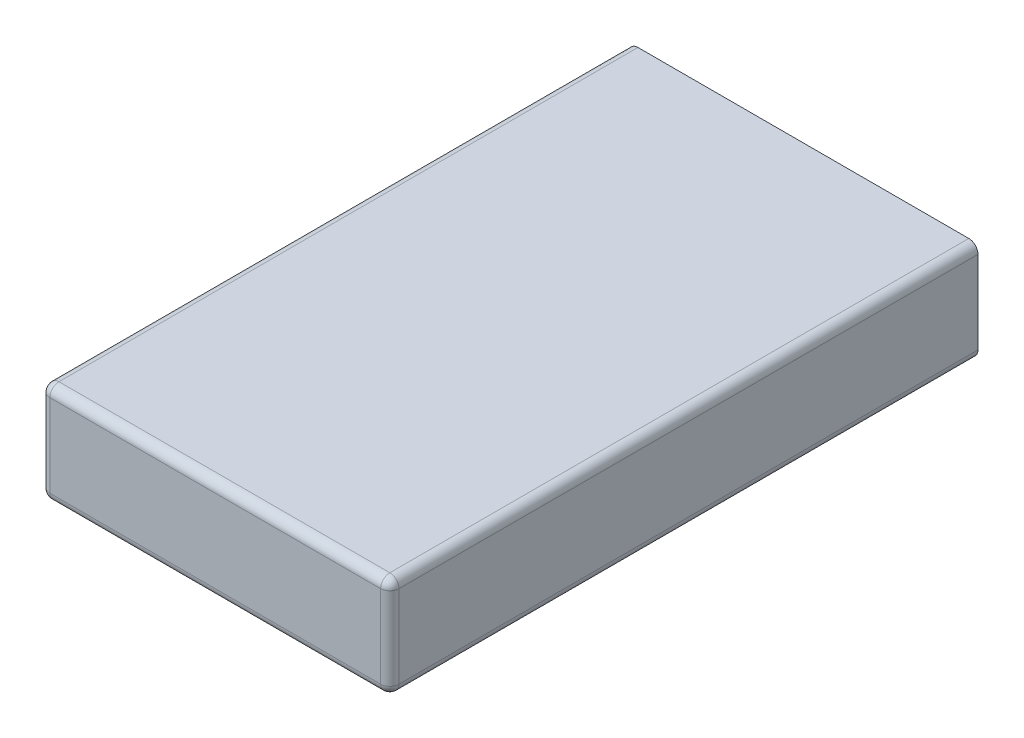
ISO-10303-21;
HEADER;
FILE_DESCRIPTION(('STEP AP214'),'2;1');
FILE_NAME('part.step','',(''),(''),'','','');
FILE_SCHEMA(('AUTOMOTIVE_DESIGN { 1 0 10303 214 1 1 1 1 }'));
ENDSEC;
DATA;
#1=APPLICATION_CONTEXT('core data for automotive mechanical design processes');
#2=APPLICATION_PROTOCOL_DEFINITION('international standard','automotive_design',2000,#1);
#3=PRODUCT_CONTEXT('',#1,'mechanical');
#4=PRODUCT('Part','Part','',(#3));
#5=PRODUCT_RELATED_PRODUCT_CATEGORY('part','',(#4));
#6=PRODUCT_DEFINITION_FORMATION('','',#4);
#7=PRODUCT_DEFINITION_CONTEXT('part definition',#1,'design');
#8=PRODUCT_DEFINITION('design','',#6,#7);
#9=PRODUCT_DEFINITION_SHAPE('','',#8);
#10=(LENGTH_UNIT() NAMED_UNIT(*) SI_UNIT(.MILLI.,.METRE.));
#11=(NAMED_UNIT(*) PLANE_ANGLE_UNIT() SI_UNIT($,.RADIAN.));
#12=(NAMED_UNIT(*) SI_UNIT($,.STERADIAN.) SOLID_ANGLE_UNIT());
#13=UNCERTAINTY_MEASURE_WITH_UNIT(LENGTH_MEASURE(1.E-05),#10,'distance_accuracy_value','');
#14=(GEOMETRIC_REPRESENTATION_CONTEXT(3) GLOBAL_UNCERTAINTY_ASSIGNED_CONTEXT((#13)) GLOBAL_UNIT_ASSIGNED_CONTEXT((#10,
#11,#12)) REPRESENTATION_CONTEXT('',''));
#15=CARTESIAN_POINT('',(0.,0.,0.));
#16=DIRECTION('',(0.,0.,1.));
#17=DIRECTION('',(1.,0.,0.));
#18=AXIS2_PLACEMENT_3D('',#15,#16,#17);
#19=CARTESIAN_POINT('',(0.,0.,0.));
#20=DIRECTION('',(0.,0.,-1.));
#21=DIRECTION('',(-1.,0.,0.));
#22=AXIS2_PLACEMENT_3D('',#19,#20,#21);
#23=PLANE('',#22);
#24=DIRECTION('',(1.,0.,0.));
#25=VECTOR('',#24,1.);
#26=CARTESIAN_POINT('',(-19.,-5.5,0.));
#27=LINE('',#26,#25);
#28=CARTESIAN_POINT('',(-18.,-5.5,0.));
#29=VERTEX_POINT('',#28);
#30=CARTESIAN_POINT('',(18.,-5.5,0.));
#31=VERTEX_POINT('',#30);
#32=EDGE_CURVE('E188',#29,#31,#27,.T.);
#33=ORIENTED_EDGE('',*,*,#32,.F.);
#34=CARTESIAN_POINT('',(-18.,-4.5,0.));
#35=DIRECTION('',(0.,0.,-1.));
#36=DIRECTION('',(-1.,0.,0.));
#37=AXIS2_PLACEMENT_3D('',#34,#35,#36);
#38=CIRCLE('',#37,1.);
#39=CARTESIAN_POINT('',(-19.,-4.5,0.));
#40=VERTEX_POINT('',#39);
#41=EDGE_CURVE('E215',#29,#40,#38,.T.);
#42=ORIENTED_EDGE('',*,*,#41,.T.);
#43=DIRECTION('',(0.,-1.,0.));
#44=VECTOR('',#43,1.);
#45=CARTESIAN_POINT('',(-19.,-5.5,0.));
#46=LINE('',#45,#44);
#47=CARTESIAN_POINT('',(-19.,4.5,0.));
#48=VERTEX_POINT('',#47);
#49=EDGE_CURVE('E185',#48,#40,#46,.T.);
#50=ORIENTED_EDGE('',*,*,#49,.F.);
#51=CARTESIAN_POINT('',(-18.,4.5,0.));
#52=DIRECTION('',(0.,0.,-1.));
#53=DIRECTION('',(-1.,0.,0.));
#54=AXIS2_PLACEMENT_3D('',#51,#52,#53);
#55=CIRCLE('',#54,1.);
#56=CARTESIAN_POINT('',(-18.,5.5,0.));
#57=VERTEX_POINT('',#56);
#58=EDGE_CURVE('E192',#48,#57,#55,.T.);
#59=ORIENTED_EDGE('',*,*,#58,.T.);
#60=DIRECTION('',(-1.,0.,0.));
#61=VECTOR('',#60,1.);
#62=CARTESIAN_POINT('',(-19.,5.5,0.));
#63=LINE('',#62,#61);
#64=CARTESIAN_POINT('',(18.,5.5,0.));
#65=VERTEX_POINT('',#64);
#66=EDGE_CURVE('E183',#65,#57,#63,.T.);
#67=ORIENTED_EDGE('',*,*,#66,.F.);
#68=CARTESIAN_POINT('',(18.,4.5,0.));
#69=DIRECTION('',(0.,0.,-1.));
#70=DIRECTION('',(-1.,0.,0.));
#71=AXIS2_PLACEMENT_3D('',#68,#69,#70);
#72=CIRCLE('',#71,1.);
#73=CARTESIAN_POINT('',(19.,4.5,0.));
#74=VERTEX_POINT('',#73);
#75=EDGE_CURVE('E200',#65,#74,#72,.T.);
#76=ORIENTED_EDGE('',*,*,#75,.T.);
#77=DIRECTION('',(0.,1.,0.));
#78=VECTOR('',#77,1.);
#79=CARTESIAN_POINT('',(19.,-5.5,0.));
#80=LINE('',#79,#78);
#81=CARTESIAN_POINT('',(19.,-4.5,0.));
#82=VERTEX_POINT('',#81);
#83=EDGE_CURVE('E181',#82,#74,#80,.T.);
#84=ORIENTED_EDGE('',*,*,#83,.F.);
#85=CARTESIAN_POINT('',(18.,-4.5,0.));
#86=DIRECTION('',(0.,0.,-1.));
#87=DIRECTION('',(-1.,0.,0.));
#88=AXIS2_PLACEMENT_3D('',#85,#86,#87);
#89=CIRCLE('',#88,1.);
#90=EDGE_CURVE('E208',#82,#31,#89,.T.);
#91=ORIENTED_EDGE('',*,*,#90,.T.);
#92=EDGE_LOOP('',(#33,#42,#50,#59,#67,#76,#84,#91));
#93=FACE_BOUND('',#92,.T.);
#94=DIRECTION('',(1.,0.,0.));
#95=VECTOR('',#94,1.);
#96=CARTESIAN_POINT('',(-18.25,-4.75,0.));
#97=LINE('',#96,#95);
#98=CARTESIAN_POINT('',(-18.25,-4.75,0.));
#99=VERTEX_POINT('',#98);
#100=CARTESIAN_POINT('',(18.25,-4.75,0.));
#101=VERTEX_POINT('',#100);
#102=EDGE_CURVE('E154',#99,#101,#97,.T.);
#103=ORIENTED_EDGE('',*,*,#102,.T.);
#104=DIRECTION('',(0.,1.,0.));
#105=VECTOR('',#104,1.);
#106=CARTESIAN_POINT('',(18.25,-4.75,0.));
#107=LINE('',#106,#105);
#108=CARTESIAN_POINT('',(18.25,4.75,0.));
#109=VERTEX_POINT('',#108);
#110=EDGE_CURVE('E167',#101,#109,#107,.T.);
#111=ORIENTED_EDGE('',*,*,#110,.T.);
#112=DIRECTION('',(-1.,0.,0.));
#113=VECTOR('',#112,1.);
#114=CARTESIAN_POINT('',(-18.25,4.75,0.));
#115=LINE('',#114,#113);
#116=CARTESIAN_POINT('',(-18.25,4.75,0.));
#117=VERTEX_POINT('',#116);
#118=EDGE_CURVE('E170',#109,#117,#115,.T.);
#119=ORIENTED_EDGE('',*,*,#118,.T.);
#120=DIRECTION('',(0.,-1.,0.));
#121=VECTOR('',#120,1.);
#122=CARTESIAN_POINT('',(-18.25,-4.75,0.));
#123=LINE('',#122,#121);
#124=EDGE_CURVE('E173',#117,#99,#123,.T.);
#125=ORIENTED_EDGE('',*,*,#124,.T.);
#126=EDGE_LOOP('',(#103,#111,#119,#125));
#127=FACE_BOUND('',#126,.T.);
#128=ADVANCED_FACE('F35',(#93,#127),#23,.T.);
#129=CARTESIAN_POINT('',(19.,-5.5,63.));
#130=DIRECTION('',(-1.,0.,0.));
#131=DIRECTION('',(0.,0.,1.));
#132=AXIS2_PLACEMENT_3D('',#129,#130,#131);
#133=PLANE('',#132);
#134=DIRECTION('',(0.,0.,-1.));
#135=VECTOR('',#134,1.);
#136=CARTESIAN_POINT('',(19.,4.5,63.));
#137=LINE('',#136,#135);
#138=CARTESIAN_POINT('',(19.,4.5,63.));
#139=VERTEX_POINT('',#138);
#140=EDGE_CURVE('E203',#74,#139,#137,.F.);
#141=ORIENTED_EDGE('',*,*,#140,.T.);
#142=DIRECTION('',(0.,1.,0.));
#143=VECTOR('',#142,1.);
#144=CARTESIAN_POINT('',(19.,-5.5,63.));
#145=LINE('',#144,#143);
#146=CARTESIAN_POINT('',(19.,-4.5,63.));
#147=VERTEX_POINT('',#146);
#148=EDGE_CURVE('E235',#139,#147,#145,.F.);
#149=ORIENTED_EDGE('',*,*,#148,.T.);
#150=DIRECTION('',(0.,0.,-1.));
#151=VECTOR('',#150,1.);
#152=CARTESIAN_POINT('',(19.,-4.5,63.));
#153=LINE('',#152,#151);
#154=EDGE_CURVE('E206',#147,#82,#153,.T.);
#155=ORIENTED_EDGE('',*,*,#154,.T.);
#156=ORIENTED_EDGE('',*,*,#83,.T.);
#157=EDGE_LOOP('',(#141,#149,#155,#156));
#158=FACE_BOUND('',#157,.T.);
#159=ADVANCED_FACE('F285',(#158),#133,.F.);
#160=CARTESIAN_POINT('',(-19.,5.5,63.));
#161=DIRECTION('',(0.,-1.,0.));
#162=DIRECTION('',(0.,0.,-1.));
#163=AXIS2_PLACEMENT_3D('',#160,#161,#162);
#164=PLANE('',#163);
#165=DIRECTION('',(0.,0.,-1.));
#166=VECTOR('',#165,1.);
#167=CARTESIAN_POINT('',(-18.,5.5,63.));
#168=LINE('',#167,#166);
#169=CARTESIAN_POINT('',(-18.,5.5,63.));
#170=VERTEX_POINT('',#169);
#171=EDGE_CURVE('E195',#57,#170,#168,.F.);
#172=ORIENTED_EDGE('',*,*,#171,.T.);
#173=DIRECTION('',(-1.,0.,0.));
#174=VECTOR('',#173,1.);
#175=CARTESIAN_POINT('',(-19.,5.5,63.));
#176=LINE('',#175,#174);
#177=CARTESIAN_POINT('',(18.,5.5,63.));
#178=VERTEX_POINT('',#177);
#179=EDGE_CURVE('E231',#170,#178,#176,.F.);
#180=ORIENTED_EDGE('',*,*,#179,.T.);
#181=DIRECTION('',(0.,0.,-1.));
#182=VECTOR('',#181,1.);
#183=CARTESIAN_POINT('',(18.,5.5,63.));
#184=LINE('',#183,#182);
#185=EDGE_CURVE('E198',#178,#65,#184,.T.);
#186=ORIENTED_EDGE('',*,*,#185,.T.);
#187=ORIENTED_EDGE('',*,*,#66,.T.);
#188=EDGE_LOOP('',(#172,#180,#186,#187));
#189=FACE_BOUND('',#188,.T.);
#190=ADVANCED_FACE('F333',(#189),#164,.F.);
#191=CARTESIAN_POINT('',(-19.,-5.5,63.));
#192=DIRECTION('',(1.,0.,0.));
#193=DIRECTION('',(0.,0.,-1.));
#194=AXIS2_PLACEMENT_3D('',#191,#192,#193);
#195=PLANE('',#194);
#196=DIRECTION('',(0.,0.,-1.));
#197=VECTOR('',#196,1.);
#198=CARTESIAN_POINT('',(-19.,-4.5,63.));
#199=LINE('',#198,#197);
#200=CARTESIAN_POINT('',(-19.,-4.5,63.));
#201=VERTEX_POINT('',#200);
#202=EDGE_CURVE('E217',#40,#201,#199,.F.);
#203=ORIENTED_EDGE('',*,*,#202,.T.);
#204=DIRECTION('',(0.,-1.,0.));
#205=VECTOR('',#204,1.);
#206=CARTESIAN_POINT('',(-19.,-5.5,63.));
#207=LINE('',#206,#205);
#208=CARTESIAN_POINT('',(-19.,4.5,63.));
#209=VERTEX_POINT('',#208);
#210=EDGE_CURVE('E11',#201,#209,#207,.F.);
#211=ORIENTED_EDGE('',*,*,#210,.T.);
#212=DIRECTION('',(0.,0.,-1.));
#213=VECTOR('',#212,1.);
#214=CARTESIAN_POINT('',(-19.,4.5,63.));
#215=LINE('',#214,#213);
#216=EDGE_CURVE('E190',#209,#48,#215,.T.);
#217=ORIENTED_EDGE('',*,*,#216,.T.);
#218=ORIENTED_EDGE('',*,*,#49,.T.);
#219=EDGE_LOOP('',(#203,#211,#217,#218));
#220=FACE_BOUND('',#219,.T.);
#221=ADVANCED_FACE('F312',(#220),#195,.F.);
#222=CARTESIAN_POINT('',(-19.,-5.5,63.));
#223=DIRECTION('',(0.,1.,0.));
#224=DIRECTION('',(0.,0.,1.));
#225=AXIS2_PLACEMENT_3D('',#222,#223,#224);
#226=PLANE('',#225);
#227=DIRECTION('',(0.,0.,-1.));
#228=VECTOR('',#227,1.);
#229=CARTESIAN_POINT('',(18.,-5.5,63.));
#230=LINE('',#229,#228);
#231=CARTESIAN_POINT('',(18.,-5.5,63.));
#232=VERTEX_POINT('',#231);
#233=EDGE_CURVE('E211',#31,#232,#230,.F.);
#234=ORIENTED_EDGE('',*,*,#233,.T.);
#235=DIRECTION('',(1.,0.,0.));
#236=VECTOR('',#235,1.);
#237=CARTESIAN_POINT('',(-19.,-5.5,63.));
#238=LINE('',#237,#236);
#239=CARTESIAN_POINT('',(-18.,-5.5,63.));
#240=VERTEX_POINT('',#239);
#241=EDGE_CURVE('E59',#232,#240,#238,.F.);
#242=ORIENTED_EDGE('',*,*,#241,.T.);
#243=DIRECTION('',(0.,0.,-1.));
#244=VECTOR('',#243,1.);
#245=CARTESIAN_POINT('',(-18.,-5.5,63.));
#246=LINE('',#245,#244);
#247=EDGE_CURVE('E213',#240,#29,#246,.T.);
#248=ORIENTED_EDGE('',*,*,#247,.T.);
#249=ORIENTED_EDGE('',*,*,#32,.T.);
#250=EDGE_LOOP('',(#234,#242,#248,#249));
#251=FACE_BOUND('',#250,.T.);
#252=ADVANCED_FACE('F275',(#251),#226,.F.);
#253=CARTESIAN_POINT('',(18.25,-4.75,63.));
#254=DIRECTION('',(-1.,0.,0.));
#255=DIRECTION('',(0.,0.,1.));
#256=AXIS2_PLACEMENT_3D('',#253,#254,#255);
#257=PLANE('',#256);
#258=ORIENTED_EDGE('',*,*,#110,.F.);
#259=DIRECTION('',(0.,0.,-1.));
#260=VECTOR('',#259,1.);
#261=CARTESIAN_POINT('',(18.25,-4.75,63.));
#262=LINE('',#261,#260);
#263=CARTESIAN_POINT('',(18.25,-4.75,63.));
#264=VERTEX_POINT('',#263);
#265=EDGE_CURVE('E148',#264,#101,#262,.T.);
#266=ORIENTED_EDGE('',*,*,#265,.F.);
#267=DIRECTION('',(0.,1.,0.));
#268=VECTOR('',#267,1.);
#269=CARTESIAN_POINT('',(18.25,-4.75,63.));
#270=LINE('',#269,#268);
#271=CARTESIAN_POINT('',(18.25,4.75,63.));
#272=VERTEX_POINT('',#271);
#273=EDGE_CURVE('E144',#264,#272,#270,.T.);
#274=ORIENTED_EDGE('',*,*,#273,.T.);
#275=DIRECTION('',(0.,0.,-1.));
#276=VECTOR('',#275,1.);
#277=CARTESIAN_POINT('',(18.25,4.75,63.));
#278=LINE('',#277,#276);
#279=EDGE_CURVE('E178',#272,#109,#278,.T.);
#280=ORIENTED_EDGE('',*,*,#279,.T.);
#281=EDGE_LOOP('',(#258,#266,#274,#280));
#282=FACE_BOUND('',#281,.T.);
#283=ADVANCED_FACE('F337',(#282),#257,.T.);
#284=CARTESIAN_POINT('',(-18.25,4.75,63.));
#285=DIRECTION('',(0.,-1.,0.));
#286=DIRECTION('',(0.,0.,-1.));
#287=AXIS2_PLACEMENT_3D('',#284,#285,#286);
#288=PLANE('',#287);
#289=ORIENTED_EDGE('',*,*,#118,.F.);
#290=ORIENTED_EDGE('',*,*,#279,.F.);
#291=DIRECTION('',(-1.,0.,0.));
#292=VECTOR('',#291,1.);
#293=CARTESIAN_POINT('',(-18.25,4.75,63.));
#294=LINE('',#293,#292);
#295=CARTESIAN_POINT('',(-18.25,4.75,63.));
#296=VERTEX_POINT('',#295);
#297=EDGE_CURVE('E162',#272,#296,#294,.T.);
#298=ORIENTED_EDGE('',*,*,#297,.T.);
#299=DIRECTION('',(0.,0.,-1.));
#300=VECTOR('',#299,1.);
#301=CARTESIAN_POINT('',(-18.25,4.75,63.));
#302=LINE('',#301,#300);
#303=EDGE_CURVE('E158',#296,#117,#302,.T.);
#304=ORIENTED_EDGE('',*,*,#303,.T.);
#305=EDGE_LOOP('',(#289,#290,#298,#304));
#306=FACE_BOUND('',#305,.T.);
#307=ADVANCED_FACE('F503',(#306),#288,.T.);
#308=CARTESIAN_POINT('',(-18.25,-4.75,63.));
#309=DIRECTION('',(1.,0.,0.));
#310=DIRECTION('',(0.,0.,-1.));
#311=AXIS2_PLACEMENT_3D('',#308,#309,#310);
#312=PLANE('',#311);
#313=ORIENTED_EDGE('',*,*,#124,.F.);
#314=ORIENTED_EDGE('',*,*,#303,.F.);
#315=DIRECTION('',(0.,-1.,0.));
#316=VECTOR('',#315,1.);
#317=CARTESIAN_POINT('',(-18.25,-4.75,63.));
#318=LINE('',#317,#316);
#319=CARTESIAN_POINT('',(-18.25,-4.75,63.));
#320=VERTEX_POINT('',#319);
#321=EDGE_CURVE('E141',#296,#320,#318,.T.);
#322=ORIENTED_EDGE('',*,*,#321,.T.);
#323=DIRECTION('',(0.,0.,-1.));
#324=VECTOR('',#323,1.);
#325=CARTESIAN_POINT('',(-18.25,-4.75,63.));
#326=LINE('',#325,#324);
#327=EDGE_CURVE('E151',#320,#99,#326,.T.);
#328=ORIENTED_EDGE('',*,*,#327,.T.);
#329=EDGE_LOOP('',(#313,#314,#322,#328));
#330=FACE_BOUND('',#329,.T.);
#331=ADVANCED_FACE('F161',(#330),#312,.T.);
#332=CARTESIAN_POINT('',(-18.25,-4.75,63.));
#333=DIRECTION('',(0.,1.,0.));
#334=DIRECTION('',(0.,0.,1.));
#335=AXIS2_PLACEMENT_3D('',#332,#333,#334);
#336=PLANE('',#335);
#337=ORIENTED_EDGE('',*,*,#102,.F.);
#338=ORIENTED_EDGE('',*,*,#327,.F.);
#339=DIRECTION('',(1.,0.,0.));
#340=VECTOR('',#339,1.);
#341=CARTESIAN_POINT('',(-18.25,-4.75,63.));
#342=LINE('',#341,#340);
#343=EDGE_CURVE('E137',#320,#264,#342,.T.);
#344=ORIENTED_EDGE('',*,*,#343,.T.);
#345=ORIENTED_EDGE('',*,*,#265,.T.);
#346=EDGE_LOOP('',(#337,#338,#344,#345));
#347=FACE_BOUND('',#346,.T.);
#348=ADVANCED_FACE('F152',(#347),#336,.T.);
#349=CARTESIAN_POINT('',(0.,0.,63.));
#350=DIRECTION('',(0.,0.,-1.));
#351=DIRECTION('',(-1.,0.,0.));
#352=AXIS2_PLACEMENT_3D('',#349,#350,#351);
#353=PLANE('',#352);
#354=ORIENTED_EDGE('',*,*,#297,.F.);
#355=ORIENTED_EDGE('',*,*,#273,.F.);
#356=ORIENTED_EDGE('',*,*,#343,.F.);
#357=ORIENTED_EDGE('',*,*,#321,.F.);
#358=EDGE_LOOP('',(#354,#355,#356,#357));
#359=FACE_BOUND('',#358,.T.);
#360=ADVANCED_FACE('F139',(#359),#353,.T.);
#361=CARTESIAN_POINT('',(0.,0.,64.));
#362=DIRECTION('',(0.,0.,-1.));
#363=DIRECTION('',(-1.,0.,0.));
#364=AXIS2_PLACEMENT_3D('',#361,#362,#363);
#365=PLANE('',#364);
#366=DIRECTION('',(0.,1.,0.));
#367=VECTOR('',#366,1.);
#368=CARTESIAN_POINT('',(18.,0.,64.));
#369=LINE('',#368,#367);
#370=CARTESIAN_POINT('',(18.,-4.5,64.));
#371=VERTEX_POINT('',#370);
#372=CARTESIAN_POINT('',(18.,4.5,64.));
#373=VERTEX_POINT('',#372);
#374=EDGE_CURVE('E226',#371,#373,#369,.T.);
#375=ORIENTED_EDGE('',*,*,#374,.T.);
#376=DIRECTION('',(-1.,0.,0.));
#377=VECTOR('',#376,1.);
#378=CARTESIAN_POINT('',(0.,4.5,64.));
#379=LINE('',#378,#377);
#380=CARTESIAN_POINT('',(-18.,4.5,64.));
#381=VERTEX_POINT('',#380);
#382=EDGE_CURVE('E228',#373,#381,#379,.T.);
#383=ORIENTED_EDGE('',*,*,#382,.T.);
#384=DIRECTION('',(0.,-1.,0.));
#385=VECTOR('',#384,1.);
#386=CARTESIAN_POINT('',(-18.,0.,64.));
#387=LINE('',#386,#385);
#388=CARTESIAN_POINT('',(-18.,-4.5,64.));
#389=VERTEX_POINT('',#388);
#390=EDGE_CURVE('E222',#381,#389,#387,.T.);
#391=ORIENTED_EDGE('',*,*,#390,.T.);
#392=DIRECTION('',(1.,0.,0.));
#393=VECTOR('',#392,1.);
#394=CARTESIAN_POINT('',(0.,-4.5,64.));
#395=LINE('',#394,#393);
#396=EDGE_CURVE('E224',#389,#371,#395,.T.);
#397=ORIENTED_EDGE('',*,*,#396,.T.);
#398=EDGE_LOOP('',(#375,#383,#391,#397));
#399=FACE_BOUND('',#398,.T.);
#400=ADVANCED_FACE('F300',(#399),#365,.F.);
#401=CARTESIAN_POINT('',(-18.,4.5,63.));
#402=DIRECTION('',(0.,0.,-1.));
#403=DIRECTION('',(-1.,0.,0.));
#404=AXIS2_PLACEMENT_3D('',#401,#402,#403);
#405=CYLINDRICAL_SURFACE('',#404,1.);
#406=ORIENTED_EDGE('',*,*,#216,.F.);
#407=CARTESIAN_POINT('',(-18.,4.5,63.));
#408=DIRECTION('',(0.,0.,-1.));
#409=DIRECTION('',(-1.,0.,0.));
#410=AXIS2_PLACEMENT_3D('',#407,#408,#409);
#411=CIRCLE('',#410,1.);
#412=EDGE_CURVE('E219',#209,#170,#411,.T.);
#413=ORIENTED_EDGE('',*,*,#412,.T.);
#414=ORIENTED_EDGE('',*,*,#171,.F.);
#415=ORIENTED_EDGE('',*,*,#58,.F.);
#416=EDGE_LOOP('',(#406,#413,#414,#415));
#417=FACE_BOUND('',#416,.T.);
#418=ADVANCED_FACE('F316',(#417),#405,.T.);
#419=CARTESIAN_POINT('',(18.,4.5,63.));
#420=DIRECTION('',(0.,0.,-1.));
#421=DIRECTION('',(-1.,0.,0.));
#422=AXIS2_PLACEMENT_3D('',#419,#420,#421);
#423=CYLINDRICAL_SURFACE('',#422,1.);
#424=ORIENTED_EDGE('',*,*,#185,.F.);
#425=CARTESIAN_POINT('',(18.,4.5,63.));
#426=DIRECTION('',(0.,0.,-1.));
#427=DIRECTION('',(-1.,0.,0.));
#428=AXIS2_PLACEMENT_3D('',#425,#426,#427);
#429=CIRCLE('',#428,1.);
#430=EDGE_CURVE('E233',#178,#139,#429,.T.);
#431=ORIENTED_EDGE('',*,*,#430,.T.);
#432=ORIENTED_EDGE('',*,*,#140,.F.);
#433=ORIENTED_EDGE('',*,*,#75,.F.);
#434=EDGE_LOOP('',(#424,#431,#432,#433));
#435=FACE_BOUND('',#434,.T.);
#436=ADVANCED_FACE('F288',(#435),#423,.T.);
#437=CARTESIAN_POINT('',(18.,-4.5,63.));
#438=DIRECTION('',(0.,0.,-1.));
#439=DIRECTION('',(-1.,0.,0.));
#440=AXIS2_PLACEMENT_3D('',#437,#438,#439);
#441=CYLINDRICAL_SURFACE('',#440,1.);
#442=ORIENTED_EDGE('',*,*,#154,.F.);
#443=CARTESIAN_POINT('',(18.,-4.5,63.));
#444=DIRECTION('',(0.,0.,-1.));
#445=DIRECTION('',(-1.,0.,0.));
#446=AXIS2_PLACEMENT_3D('',#443,#444,#445);
#447=CIRCLE('',#446,1.);
#448=EDGE_CURVE('E237',#147,#232,#447,.T.);
#449=ORIENTED_EDGE('',*,*,#448,.T.);
#450=ORIENTED_EDGE('',*,*,#233,.F.);
#451=ORIENTED_EDGE('',*,*,#90,.F.);
#452=EDGE_LOOP('',(#442,#449,#450,#451));
#453=FACE_BOUND('',#452,.T.);
#454=ADVANCED_FACE('F273',(#453),#441,.T.);
#455=CARTESIAN_POINT('',(-18.,-4.5,63.));
#456=DIRECTION('',(0.,0.,-1.));
#457=DIRECTION('',(-1.,0.,0.));
#458=AXIS2_PLACEMENT_3D('',#455,#456,#457);
#459=CYLINDRICAL_SURFACE('',#458,1.);
#460=ORIENTED_EDGE('',*,*,#247,.F.);
#461=CARTESIAN_POINT('',(-18.,-4.5,63.));
#462=DIRECTION('',(0.,0.,-1.));
#463=DIRECTION('',(-1.,0.,0.));
#464=AXIS2_PLACEMENT_3D('',#461,#462,#463);
#465=CIRCLE('',#464,1.);
#466=EDGE_CURVE('E44',#240,#201,#465,.T.);
#467=ORIENTED_EDGE('',*,*,#466,.T.);
#468=ORIENTED_EDGE('',*,*,#202,.F.);
#469=ORIENTED_EDGE('',*,*,#41,.F.);
#470=EDGE_LOOP('',(#460,#467,#468,#469));
#471=FACE_BOUND('',#470,.T.);
#472=ADVANCED_FACE('F351',(#471),#459,.T.);
#473=CARTESIAN_POINT('',(18.,-4.5,63.));
#474=DIRECTION('',(0.,0.,-1.));
#475=DIRECTION('',(-1.,0.,0.));
#476=AXIS2_PLACEMENT_3D('',#473,#474,#475);
#477=SPHERICAL_SURFACE('',#476,1.);
#478=CARTESIAN_POINT('',(18.,-4.5,63.));
#479=DIRECTION('',(-1.,0.,0.));
#480=DIRECTION('',(0.,0.,1.));
#481=AXIS2_PLACEMENT_3D('',#478,#479,#480);
#482=CIRCLE('',#481,1.);
#483=EDGE_CURVE('E256',#232,#371,#482,.T.);
#484=ORIENTED_EDGE('',*,*,#483,.F.);
#485=ORIENTED_EDGE('',*,*,#448,.F.);
#486=CARTESIAN_POINT('',(18.,-4.5,63.));
#487=DIRECTION('',(0.,1.,0.));
#488=DIRECTION('',(0.,0.,1.));
#489=AXIS2_PLACEMENT_3D('',#486,#487,#488);
#490=CIRCLE('',#489,1.);
#491=EDGE_CURVE('E39',#371,#147,#490,.T.);
#492=ORIENTED_EDGE('',*,*,#491,.F.);
#493=EDGE_LOOP('',(#484,#485,#492));
#494=FACE_BOUND('',#493,.T.);
#495=ADVANCED_FACE('F37',(#494),#477,.T.);
#496=CARTESIAN_POINT('',(18.,0.,63.));
#497=DIRECTION('',(0.,1.,0.));
#498=DIRECTION('',(0.,0.,1.));
#499=AXIS2_PLACEMENT_3D('',#496,#497,#498);
#500=CYLINDRICAL_SURFACE('',#499,1.);
#501=ORIENTED_EDGE('',*,*,#491,.T.);
#502=ORIENTED_EDGE('',*,*,#148,.F.);
#503=CARTESIAN_POINT('',(18.,4.5,63.));
#504=DIRECTION('',(0.,1.,0.));
#505=DIRECTION('',(-1.,0.,0.));
#506=AXIS2_PLACEMENT_3D('',#503,#504,#505);
#507=CIRCLE('',#506,1.);
#508=EDGE_CURVE('E254',#373,#139,#507,.T.);
#509=ORIENTED_EDGE('',*,*,#508,.F.);
#510=ORIENTED_EDGE('',*,*,#374,.F.);
#511=EDGE_LOOP('',(#501,#502,#509,#510));
#512=FACE_BOUND('',#511,.T.);
#513=ADVANCED_FACE('F266',(#512),#500,.T.);
#514=CARTESIAN_POINT('',(0.,-4.5,63.));
#515=DIRECTION('',(1.,0.,0.));
#516=DIRECTION('',(0.,0.,-1.));
#517=AXIS2_PLACEMENT_3D('',#514,#515,#516);
#518=CYLINDRICAL_SURFACE('',#517,1.);
#519=ORIENTED_EDGE('',*,*,#483,.T.);
#520=ORIENTED_EDGE('',*,*,#396,.F.);
#521=CARTESIAN_POINT('',(-18.,-4.5,63.));
#522=DIRECTION('',(-1.,0.,0.));
#523=DIRECTION('',(0.,0.,1.));
#524=AXIS2_PLACEMENT_3D('',#521,#522,#523);
#525=CIRCLE('',#524,1.);
#526=EDGE_CURVE('E251',#240,#389,#525,.T.);
#527=ORIENTED_EDGE('',*,*,#526,.F.);
#528=ORIENTED_EDGE('',*,*,#241,.F.);
#529=EDGE_LOOP('',(#519,#520,#527,#528));
#530=FACE_BOUND('',#529,.T.);
#531=ADVANCED_FACE('F302',(#530),#518,.T.);
#532=CARTESIAN_POINT('',(18.,4.5,63.));
#533=DIRECTION('',(0.,0.,-1.));
#534=DIRECTION('',(-1.,0.,0.));
#535=AXIS2_PLACEMENT_3D('',#532,#533,#534);
#536=SPHERICAL_SURFACE('',#535,1.);
#537=ORIENTED_EDGE('',*,*,#508,.T.);
#538=ORIENTED_EDGE('',*,*,#430,.F.);
#539=CARTESIAN_POINT('',(18.,4.5,63.));
#540=DIRECTION('',(-1.,0.,0.));
#541=DIRECTION('',(0.,0.,1.));
#542=AXIS2_PLACEMENT_3D('',#539,#540,#541);
#543=CIRCLE('',#542,1.);
#544=EDGE_CURVE('E248',#373,#178,#543,.T.);
#545=ORIENTED_EDGE('',*,*,#544,.F.);
#546=EDGE_LOOP('',(#537,#538,#545));
#547=FACE_BOUND('',#546,.T.);
#548=ADVANCED_FACE('F292',(#547),#536,.T.);
#549=CARTESIAN_POINT('',(-18.,-4.5,63.));
#550=DIRECTION('',(0.,0.,-1.));
#551=DIRECTION('',(-1.,0.,0.));
#552=AXIS2_PLACEMENT_3D('',#549,#550,#551);
#553=SPHERICAL_SURFACE('',#552,1.);
#554=ORIENTED_EDGE('',*,*,#466,.F.);
#555=ORIENTED_EDGE('',*,*,#526,.T.);
#556=CARTESIAN_POINT('',(-18.,-4.5,63.));
#557=DIRECTION('',(0.,1.,0.));
#558=DIRECTION('',(0.,0.,1.));
#559=AXIS2_PLACEMENT_3D('',#556,#557,#558);
#560=CIRCLE('',#559,1.);
#561=EDGE_CURVE('E245',#201,#389,#560,.T.);
#562=ORIENTED_EDGE('',*,*,#561,.F.);
#563=EDGE_LOOP('',(#554,#555,#562));
#564=FACE_BOUND('',#563,.T.);
#565=ADVANCED_FACE('F305',(#564),#553,.T.);
#566=CARTESIAN_POINT('',(0.,4.5,63.));
#567=DIRECTION('',(-1.,0.,0.));
#568=DIRECTION('',(0.,0.,1.));
#569=AXIS2_PLACEMENT_3D('',#566,#567,#568);
#570=CYLINDRICAL_SURFACE('',#569,1.);
#571=ORIENTED_EDGE('',*,*,#544,.T.);
#572=ORIENTED_EDGE('',*,*,#179,.F.);
#573=CARTESIAN_POINT('',(-18.,4.5,63.));
#574=DIRECTION('',(-1.,0.,0.));
#575=DIRECTION('',(0.,0.,1.));
#576=AXIS2_PLACEMENT_3D('',#573,#574,#575);
#577=CIRCLE('',#576,1.);
#578=EDGE_CURVE('E243',#381,#170,#577,.T.);
#579=ORIENTED_EDGE('',*,*,#578,.F.);
#580=ORIENTED_EDGE('',*,*,#382,.F.);
#581=EDGE_LOOP('',(#571,#572,#579,#580));
#582=FACE_BOUND('',#581,.T.);
#583=ADVANCED_FACE('F296',(#582),#570,.T.);
#584=CARTESIAN_POINT('',(-18.,0.,63.));
#585=DIRECTION('',(0.,-1.,0.));
#586=DIRECTION('',(0.,0.,-1.));
#587=AXIS2_PLACEMENT_3D('',#584,#585,#586);
#588=CYLINDRICAL_SURFACE('',#587,1.);
#589=ORIENTED_EDGE('',*,*,#561,.T.);
#590=ORIENTED_EDGE('',*,*,#390,.F.);
#591=CARTESIAN_POINT('',(-18.,4.5,63.));
#592=DIRECTION('',(0.,1.,0.));
#593=DIRECTION('',(0.,0.,1.));
#594=AXIS2_PLACEMENT_3D('',#591,#592,#593);
#595=CIRCLE('',#594,1.);
#596=EDGE_CURVE('E241',#209,#381,#595,.T.);
#597=ORIENTED_EDGE('',*,*,#596,.F.);
#598=ORIENTED_EDGE('',*,*,#210,.F.);
#599=EDGE_LOOP('',(#589,#590,#597,#598));
#600=FACE_BOUND('',#599,.T.);
#601=ADVANCED_FACE('F308',(#600),#588,.T.);
#602=CARTESIAN_POINT('',(-18.,4.5,63.));
#603=DIRECTION('',(0.,0.,-1.));
#604=DIRECTION('',(-1.,0.,0.));
#605=AXIS2_PLACEMENT_3D('',#602,#603,#604);
#606=SPHERICAL_SURFACE('',#605,1.);
#607=ORIENTED_EDGE('',*,*,#578,.T.);
#608=ORIENTED_EDGE('',*,*,#412,.F.);
#609=ORIENTED_EDGE('',*,*,#596,.T.);
#610=EDGE_LOOP('',(#607,#608,#609));
#611=FACE_BOUND('',#610,.T.);
#612=ADVANCED_FACE('F320',(#611),#606,.T.);
#613=CLOSED_SHELL('',(#128,#159,#190,#221,#252,#283,#307,#331,#348,#360,#400,#418,#436,#454,
#472,#495,#513,#531,#548,#565,#583,#601,#612));
#614=MANIFOLD_SOLID_BREP('B2',#613);
#615=ADVANCED_BREP_SHAPE_REPRESENTATION('',(#18,#614),#14);
#616=SHAPE_DEFINITION_REPRESENTATION(#9,#615);
ENDSEC;
END-ISO-10303-21;
